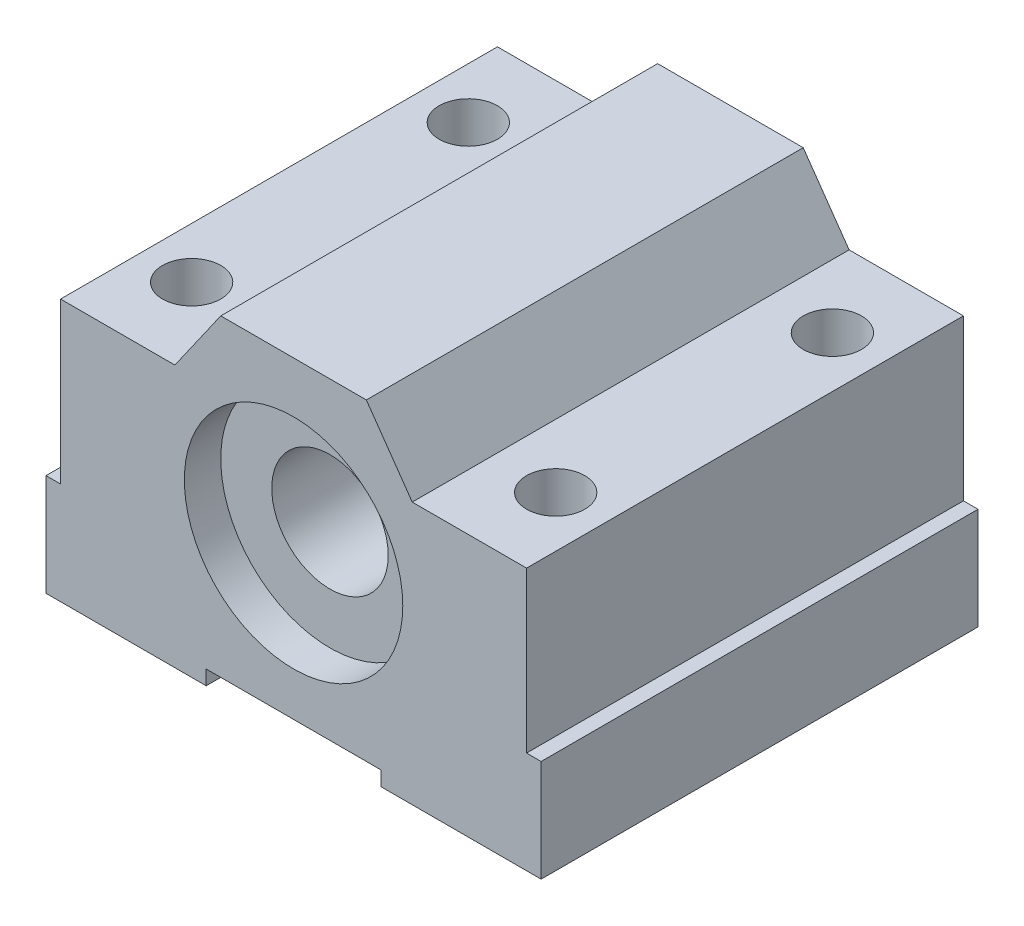
ISO-10303-21;
HEADER;
FILE_DESCRIPTION(('STEP AP214'),'2;1');
FILE_NAME('part.step','',(''),(''),'','','');
FILE_SCHEMA(('AUTOMOTIVE_DESIGN { 1 0 10303 214 1 1 1 1 }'));
ENDSEC;
DATA;
#1=APPLICATION_CONTEXT('core data for automotive mechanical design processes');
#2=APPLICATION_PROTOCOL_DEFINITION('international standard','automotive_design',2000,#1);
#3=PRODUCT_CONTEXT('',#1,'mechanical');
#4=PRODUCT('Part','Part','',(#3));
#5=PRODUCT_RELATED_PRODUCT_CATEGORY('part','',(#4));
#6=PRODUCT_DEFINITION_FORMATION('','',#4);
#7=PRODUCT_DEFINITION_CONTEXT('part definition',#1,'design');
#8=PRODUCT_DEFINITION('design','',#6,#7);
#9=PRODUCT_DEFINITION_SHAPE('','',#8);
#10=(LENGTH_UNIT() NAMED_UNIT(*) SI_UNIT(.MILLI.,.METRE.));
#11=(NAMED_UNIT(*) PLANE_ANGLE_UNIT() SI_UNIT($,.RADIAN.));
#12=(NAMED_UNIT(*) SI_UNIT($,.STERADIAN.) SOLID_ANGLE_UNIT());
#13=UNCERTAINTY_MEASURE_WITH_UNIT(LENGTH_MEASURE(1.E-05),#10,'distance_accuracy_value','');
#14=(GEOMETRIC_REPRESENTATION_CONTEXT(3) GLOBAL_UNCERTAINTY_ASSIGNED_CONTEXT((#13)) GLOBAL_UNIT_ASSIGNED_CONTEXT((#10,
#11,#12)) REPRESENTATION_CONTEXT('',''));
#15=CARTESIAN_POINT('',(0.,0.,0.));
#16=DIRECTION('',(0.,0.,1.));
#17=DIRECTION('',(1.,0.,0.));
#18=AXIS2_PLACEMENT_3D('',#15,#16,#17);
#19=CARTESIAN_POINT('',(17.,11.5,-30.));
#20=DIRECTION('',(0.,0.,1.));
#21=DIRECTION('',(1.,0.,0.));
#22=AXIS2_PLACEMENT_3D('',#19,#20,#21);
#23=CYLINDRICAL_SURFACE('',#22,4.);
#24=CARTESIAN_POINT('',(17.,11.5,-2.5));
#25=DIRECTION('',(0.,0.,1.));
#26=DIRECTION('',(1.,0.,0.));
#27=AXIS2_PLACEMENT_3D('',#24,#25,#26);
#28=CIRCLE('',#27,4.);
#29=CARTESIAN_POINT('',(21.,11.5,-2.5));
#30=VERTEX_POINT('',#29);
#31=EDGE_CURVE('E261',#30,#30,#28,.T.);
#32=ORIENTED_EDGE('',*,*,#31,.T.);
#33=EDGE_LOOP('',(#32));
#34=FACE_BOUND('',#33,.T.);
#35=CARTESIAN_POINT('',(17.,11.5,-27.5));
#36=DIRECTION('',(0.,0.,-1.));
#37=DIRECTION('',(-1.,0.,0.));
#38=AXIS2_PLACEMENT_3D('',#35,#36,#37);
#39=CIRCLE('',#38,4.);
#40=CARTESIAN_POINT('',(13.,11.5,-27.5));
#41=VERTEX_POINT('',#40);
#42=EDGE_CURVE('E38',#41,#41,#39,.F.);
#43=ORIENTED_EDGE('',*,*,#42,.F.);
#44=EDGE_LOOP('',(#43));
#45=FACE_BOUND('',#44,.T.);
#46=ADVANCED_FACE('F34',(#34,#45),#23,.F.);
#47=CARTESIAN_POINT('',(0.,18.,0.));
#48=DIRECTION('',(0.,-1.,0.));
#49=DIRECTION('',(0.,0.,-1.));
#50=AXIS2_PLACEMENT_3D('',#47,#48,#49);
#51=PLANE('',#50);
#52=CARTESIAN_POINT('',(4.5,18.,-24.5));
#53=DIRECTION('',(0.,1.,0.));
#54=DIRECTION('',(0.,0.,-1.));
#55=AXIS2_PLACEMENT_3D('',#52,#53,#54);
#56=CIRCLE('',#55,2.00000000000001);
#57=CARTESIAN_POINT('',(4.5,18.,-26.5));
#58=VERTEX_POINT('',#57);
#59=EDGE_CURVE('E447',#58,#58,#56,.T.);
#60=ORIENTED_EDGE('',*,*,#59,.F.);
#61=EDGE_LOOP('',(#60));
#62=FACE_BOUND('',#61,.T.);
#63=CARTESIAN_POINT('',(4.5,18.,-5.5));
#64=DIRECTION('',(0.,1.,0.));
#65=DIRECTION('',(0.,0.,-1.));
#66=AXIS2_PLACEMENT_3D('',#63,#64,#65);
#67=CIRCLE('',#66,2.00000000000001);
#68=CARTESIAN_POINT('',(4.5,18.,-7.50000000000001));
#69=VERTEX_POINT('',#68);
#70=EDGE_CURVE('E455',#69,#69,#67,.T.);
#71=ORIENTED_EDGE('',*,*,#70,.F.);
#72=EDGE_LOOP('',(#71));
#73=FACE_BOUND('',#72,.T.);
#74=DIRECTION('',(1.,0.,0.));
#75=VECTOR('',#74,1.);
#76=CARTESIAN_POINT('',(0.,18.,0.));
#77=LINE('',#76,#75);
#78=CARTESIAN_POINT('',(1.,18.,0.));
#79=VERTEX_POINT('',#78);
#80=CARTESIAN_POINT('',(8.85010376910488,18.,0.));
#81=VERTEX_POINT('',#80);
#82=EDGE_CURVE('E167',#79,#81,#77,.T.);
#83=ORIENTED_EDGE('',*,*,#82,.T.);
#84=DIRECTION('',(0.,0.,-1.));
#85=VECTOR('',#84,1.);
#86=CARTESIAN_POINT('',(8.85010376910488,18.,0.));
#87=LINE('',#86,#85);
#88=CARTESIAN_POINT('',(8.85010376910487,18.,-30.));
#89=VERTEX_POINT('',#88);
#90=EDGE_CURVE('E11',#81,#89,#87,.T.);
#91=ORIENTED_EDGE('',*,*,#90,.T.);
#92=DIRECTION('',(1.,0.,0.));
#93=VECTOR('',#92,1.);
#94=CARTESIAN_POINT('',(0.,18.,-30.));
#95=LINE('',#94,#93);
#96=CARTESIAN_POINT('',(1.,18.,-30.));
#97=VERTEX_POINT('',#96);
#98=EDGE_CURVE('E151',#97,#89,#95,.T.);
#99=ORIENTED_EDGE('',*,*,#98,.F.);
#100=DIRECTION('',(0.,0.,1.));
#101=VECTOR('',#100,1.);
#102=CARTESIAN_POINT('',(1.,18.,0.));
#103=LINE('',#102,#101);
#104=EDGE_CURVE('E161',#97,#79,#103,.T.);
#105=ORIENTED_EDGE('',*,*,#104,.T.);
#106=EDGE_LOOP('',(#83,#91,#99,#105));
#107=FACE_BOUND('',#106,.T.);
#108=ADVANCED_FACE('F346',(#62,#73,#107),#51,.F.);
#109=CARTESIAN_POINT('',(0.,7.,0.));
#110=DIRECTION('',(0.,-1.,0.));
#111=DIRECTION('',(0.,0.,-1.));
#112=AXIS2_PLACEMENT_3D('',#109,#110,#111);
#113=PLANE('',#112);
#114=DIRECTION('',(0.,0.,1.));
#115=VECTOR('',#114,1.);
#116=CARTESIAN_POINT('',(1.,7.,0.));
#117=LINE('',#116,#115);
#118=CARTESIAN_POINT('',(1.,7.,-30.));
#119=VERTEX_POINT('',#118);
#120=CARTESIAN_POINT('',(1.,7.,0.));
#121=VERTEX_POINT('',#120);
#122=EDGE_CURVE('E152',#119,#121,#117,.T.);
#123=ORIENTED_EDGE('',*,*,#122,.F.);
#124=DIRECTION('',(1.,0.,0.));
#125=VECTOR('',#124,1.);
#126=CARTESIAN_POINT('',(0.,7.,-30.));
#127=LINE('',#126,#125);
#128=CARTESIAN_POINT('',(0.,7.,-30.));
#129=VERTEX_POINT('',#128);
#130=EDGE_CURVE('E209',#129,#119,#127,.T.);
#131=ORIENTED_EDGE('',*,*,#130,.F.);
#132=DIRECTION('',(0.,0.,-1.));
#133=VECTOR('',#132,1.);
#134=CARTESIAN_POINT('',(0.,7.,0.));
#135=LINE('',#134,#133);
#136=CARTESIAN_POINT('',(0.,7.,0.));
#137=VERTEX_POINT('',#136);
#138=EDGE_CURVE('E204',#137,#129,#135,.T.);
#139=ORIENTED_EDGE('',*,*,#138,.F.);
#140=DIRECTION('',(1.,0.,0.));
#141=VECTOR('',#140,1.);
#142=CARTESIAN_POINT('',(0.,7.,0.));
#143=LINE('',#142,#141);
#144=EDGE_CURVE('E216',#137,#121,#143,.T.);
#145=ORIENTED_EDGE('',*,*,#144,.T.);
#146=EDGE_LOOP('',(#123,#131,#139,#145));
#147=FACE_BOUND('',#146,.T.);
#148=ADVANCED_FACE('F338',(#147),#113,.F.);
#149=CARTESIAN_POINT('',(0.,1.,-30.));
#150=DIRECTION('',(0.,0.,-1.));
#151=DIRECTION('',(-1.,0.,0.));
#152=AXIS2_PLACEMENT_3D('',#149,#150,#151);
#153=PLANE('',#152);
#154=CARTESIAN_POINT('',(17.,11.5,-30.));
#155=DIRECTION('',(0.,0.,-1.));
#156=DIRECTION('',(-1.,0.,0.));
#157=AXIS2_PLACEMENT_3D('',#154,#155,#156);
#158=CIRCLE('',#157,7.5);
#159=CARTESIAN_POINT('',(9.5,11.5,-30.));
#160=VERTEX_POINT('',#159);
#161=EDGE_CURVE('E274',#160,#160,#158,.T.);
#162=ORIENTED_EDGE('',*,*,#161,.F.);
#163=EDGE_LOOP('',(#162));
#164=FACE_BOUND('',#163,.T.);
#165=DIRECTION('',(-0.57357643635105,0.819152044288989,0.));
#166=VECTOR('',#165,1.);
#167=CARTESIAN_POINT('',(24.8632209488859,18.4094147325837,-30.));
#168=LINE('',#167,#166);
#169=CARTESIAN_POINT('',(21.9989623089514,22.5,-30.));
#170=VERTEX_POINT('',#169);
#171=CARTESIAN_POINT('',(25.1498962308951,18.,-30.));
#172=VERTEX_POINT('',#171);
#173=EDGE_CURVE('E149',#170,#172,#168,.F.);
#174=ORIENTED_EDGE('',*,*,#173,.T.);
#175=CARTESIAN_POINT('',(33.,18.,-30.));
#176=VERTEX_POINT('',#175);
#177=EDGE_CURVE('E52',#172,#176,#95,.T.);
#178=ORIENTED_EDGE('',*,*,#177,.T.);
#179=DIRECTION('',(0.,-1.,0.));
#180=VECTOR('',#179,1.);
#181=CARTESIAN_POINT('',(33.,18.,-30.));
#182=LINE('',#181,#180);
#183=CARTESIAN_POINT('',(33.,7.,-30.));
#184=VERTEX_POINT('',#183);
#185=EDGE_CURVE('E146',#176,#184,#182,.T.);
#186=ORIENTED_EDGE('',*,*,#185,.T.);
#187=CARTESIAN_POINT('',(34.,7.,-30.));
#188=VERTEX_POINT('',#187);
#189=EDGE_CURVE('E207',#184,#188,#127,.T.);
#190=ORIENTED_EDGE('',*,*,#189,.T.);
#191=DIRECTION('',(0.,-1.,0.));
#192=VECTOR('',#191,1.);
#193=CARTESIAN_POINT('',(34.,1.,-30.));
#194=LINE('',#193,#192);
#195=CARTESIAN_POINT('',(34.,0.,-30.));
#196=VERTEX_POINT('',#195);
#197=EDGE_CURVE('E228',#188,#196,#194,.T.);
#198=ORIENTED_EDGE('',*,*,#197,.T.);
#199=DIRECTION('',(1.,0.,0.));
#200=VECTOR('',#199,1.);
#201=CARTESIAN_POINT('',(0.,0.,-30.));
#202=LINE('',#201,#200);
#203=CARTESIAN_POINT('',(23.,0.,-30.));
#204=VERTEX_POINT('',#203);
#205=EDGE_CURVE('E223',#204,#196,#202,.T.);
#206=ORIENTED_EDGE('',*,*,#205,.F.);
#207=DIRECTION('',(0.,-1.,0.));
#208=VECTOR('',#207,1.);
#209=CARTESIAN_POINT('',(23.,1.,-30.));
#210=LINE('',#209,#208);
#211=CARTESIAN_POINT('',(23.,1.,-30.));
#212=VERTEX_POINT('',#211);
#213=EDGE_CURVE('E245',#212,#204,#210,.T.);
#214=ORIENTED_EDGE('',*,*,#213,.F.);
#215=DIRECTION('',(1.,0.,0.));
#216=VECTOR('',#215,1.);
#217=CARTESIAN_POINT('',(0.,1.,-30.));
#218=LINE('',#217,#216);
#219=CARTESIAN_POINT('',(11.,1.,-30.));
#220=VERTEX_POINT('',#219);
#221=EDGE_CURVE('E203',#220,#212,#218,.T.);
#222=ORIENTED_EDGE('',*,*,#221,.F.);
#223=DIRECTION('',(0.,-1.,0.));
#224=VECTOR('',#223,1.);
#225=CARTESIAN_POINT('',(11.,1.,-30.));
#226=LINE('',#225,#224);
#227=CARTESIAN_POINT('',(11.,0.,-30.));
#228=VERTEX_POINT('',#227);
#229=EDGE_CURVE('E188',#220,#228,#226,.T.);
#230=ORIENTED_EDGE('',*,*,#229,.T.);
#231=DIRECTION('',(1.,0.,0.));
#232=VECTOR('',#231,1.);
#233=CARTESIAN_POINT('',(0.,0.,-30.));
#234=LINE('',#233,#232);
#235=CARTESIAN_POINT('',(0.,0.,-30.));
#236=VERTEX_POINT('',#235);
#237=EDGE_CURVE('E180',#236,#228,#234,.T.);
#238=ORIENTED_EDGE('',*,*,#237,.F.);
#239=DIRECTION('',(0.,-1.,0.));
#240=VECTOR('',#239,1.);
#241=CARTESIAN_POINT('',(0.,7.,-30.));
#242=LINE('',#241,#240);
#243=EDGE_CURVE('E218',#129,#236,#242,.T.);
#244=ORIENTED_EDGE('',*,*,#243,.F.);
#245=ORIENTED_EDGE('',*,*,#130,.T.);
#246=DIRECTION('',(0.,-1.,0.));
#247=VECTOR('',#246,1.);
#248=CARTESIAN_POINT('',(1.,18.,-30.));
#249=LINE('',#248,#247);
#250=EDGE_CURVE('E177',#97,#119,#249,.T.);
#251=ORIENTED_EDGE('',*,*,#250,.F.);
#252=ORIENTED_EDGE('',*,*,#98,.T.);
#253=DIRECTION('',(0.573576436351051,0.819152044288989,0.));
#254=VECTOR('',#253,1.);
#255=CARTESIAN_POINT('',(-2.04887851234972,2.43464017922319,-30.));
#256=LINE('',#255,#254);
#257=CARTESIAN_POINT('',(12.0010376910486,22.5,-30.));
#258=VERTEX_POINT('',#257);
#259=EDGE_CURVE('E258',#89,#258,#256,.T.);
#260=ORIENTED_EDGE('',*,*,#259,.T.);
#261=DIRECTION('',(-1.,0.,0.));
#262=VECTOR('',#261,1.);
#263=CARTESIAN_POINT('',(0.,22.5,-30.));
#264=LINE('',#263,#262);
#265=EDGE_CURVE('E286',#170,#258,#264,.T.);
#266=ORIENTED_EDGE('',*,*,#265,.F.);
#267=EDGE_LOOP('',(#174,#178,#186,#190,#198,#206,#214,#222,#230,#238,#244,#245,#251,#252,#260,#266));
#268=FACE_BOUND('',#267,.T.);
#269=ADVANCED_FACE('F145',(#164,#268),#153,.T.);
#270=CARTESIAN_POINT('',(23.,1.,0.));
#271=DIRECTION('',(1.,0.,0.));
#272=DIRECTION('',(0.,0.,-1.));
#273=AXIS2_PLACEMENT_3D('',#270,#271,#272);
#274=PLANE('',#273);
#275=DIRECTION('',(0.,0.,1.));
#276=VECTOR('',#275,1.);
#277=CARTESIAN_POINT('',(23.,0.,0.));
#278=LINE('',#277,#276);
#279=CARTESIAN_POINT('',(23.,0.,0.));
#280=VERTEX_POINT('',#279);
#281=EDGE_CURVE('E232',#204,#280,#278,.T.);
#282=ORIENTED_EDGE('',*,*,#281,.T.);
#283=DIRECTION('',(0.,-1.,0.));
#284=VECTOR('',#283,1.);
#285=CARTESIAN_POINT('',(23.,1.,0.));
#286=LINE('',#285,#284);
#287=CARTESIAN_POINT('',(23.,1.,0.));
#288=VERTEX_POINT('',#287);
#289=EDGE_CURVE('E242',#288,#280,#286,.T.);
#290=ORIENTED_EDGE('',*,*,#289,.F.);
#291=DIRECTION('',(0.,0.,1.));
#292=VECTOR('',#291,1.);
#293=CARTESIAN_POINT('',(23.,1.,0.));
#294=LINE('',#293,#292);
#295=EDGE_CURVE('E225',#212,#288,#294,.T.);
#296=ORIENTED_EDGE('',*,*,#295,.F.);
#297=ORIENTED_EDGE('',*,*,#213,.T.);
#298=EDGE_LOOP('',(#282,#290,#296,#297));
#299=FACE_BOUND('',#298,.T.);
#300=ADVANCED_FACE('F320',(#299),#274,.F.);
#301=CARTESIAN_POINT('',(0.,1.,0.));
#302=DIRECTION('',(0.,0.,-1.));
#303=DIRECTION('',(-1.,0.,0.));
#304=AXIS2_PLACEMENT_3D('',#301,#302,#303);
#305=PLANE('',#304);
#306=CARTESIAN_POINT('',(17.,11.5,0.));
#307=DIRECTION('',(0.,0.,1.));
#308=DIRECTION('',(1.,0.,0.));
#309=AXIS2_PLACEMENT_3D('',#306,#307,#308);
#310=CIRCLE('',#309,7.5);
#311=CARTESIAN_POINT('',(24.5,11.5,0.));
#312=VERTEX_POINT('',#311);
#313=EDGE_CURVE('E263',#312,#312,#310,.T.);
#314=ORIENTED_EDGE('',*,*,#313,.F.);
#315=EDGE_LOOP('',(#314));
#316=FACE_BOUND('',#315,.T.);
#317=CARTESIAN_POINT('',(25.1498962308951,18.,0.));
#318=VERTEX_POINT('',#317);
#319=CARTESIAN_POINT('',(33.,18.,0.));
#320=VERTEX_POINT('',#319);
#321=EDGE_CURVE('E164',#318,#320,#77,.T.);
#322=ORIENTED_EDGE('',*,*,#321,.F.);
#323=DIRECTION('',(0.57357643635105,-0.819152044288989,0.));
#324=VECTOR('',#323,1.);
#325=CARTESIAN_POINT('',(25.5,17.5,0.));
#326=LINE('',#325,#324);
#327=CARTESIAN_POINT('',(21.9989623089514,22.5,0.));
#328=VERTEX_POINT('',#327);
#329=EDGE_CURVE('E250',#318,#328,#326,.F.);
#330=ORIENTED_EDGE('',*,*,#329,.T.);
#331=DIRECTION('',(1.,0.,0.));
#332=VECTOR('',#331,1.);
#333=CARTESIAN_POINT('',(0.,22.5,0.));
#334=LINE('',#333,#332);
#335=CARTESIAN_POINT('',(12.0010376910486,22.5,0.));
#336=VERTEX_POINT('',#335);
#337=EDGE_CURVE('E174',#336,#328,#334,.T.);
#338=ORIENTED_EDGE('',*,*,#337,.F.);
#339=DIRECTION('',(-0.573576436351051,-0.819152044288989,0.));
#340=VECTOR('',#339,1.);
#341=CARTESIAN_POINT('',(12.0010376910486,22.5,0.));
#342=LINE('',#341,#340);
#343=EDGE_CURVE('E247',#336,#81,#342,.T.);
#344=ORIENTED_EDGE('',*,*,#343,.T.);
#345=ORIENTED_EDGE('',*,*,#82,.F.);
#346=DIRECTION('',(0.,-1.,0.));
#347=VECTOR('',#346,1.);
#348=CARTESIAN_POINT('',(1.,18.,0.));
#349=LINE('',#348,#347);
#350=EDGE_CURVE('E181',#79,#121,#349,.T.);
#351=ORIENTED_EDGE('',*,*,#350,.T.);
#352=ORIENTED_EDGE('',*,*,#144,.F.);
#353=DIRECTION('',(0.,-1.,0.));
#354=VECTOR('',#353,1.);
#355=CARTESIAN_POINT('',(0.,7.,0.));
#356=LINE('',#355,#354);
#357=CARTESIAN_POINT('',(0.,0.,0.));
#358=VERTEX_POINT('',#357);
#359=EDGE_CURVE('E221',#137,#358,#356,.T.);
#360=ORIENTED_EDGE('',*,*,#359,.T.);
#361=DIRECTION('',(1.,0.,0.));
#362=VECTOR('',#361,1.);
#363=CARTESIAN_POINT('',(0.,0.,0.));
#364=LINE('',#363,#362);
#365=CARTESIAN_POINT('',(11.,0.,0.));
#366=VERTEX_POINT('',#365);
#367=EDGE_CURVE('E195',#358,#366,#364,.T.);
#368=ORIENTED_EDGE('',*,*,#367,.T.);
#369=DIRECTION('',(0.,-1.,0.));
#370=VECTOR('',#369,1.);
#371=CARTESIAN_POINT('',(11.,1.,0.));
#372=LINE('',#371,#370);
#373=CARTESIAN_POINT('',(11.,1.,0.));
#374=VERTEX_POINT('',#373);
#375=EDGE_CURVE('E201',#374,#366,#372,.T.);
#376=ORIENTED_EDGE('',*,*,#375,.F.);
#377=DIRECTION('',(1.,0.,0.));
#378=VECTOR('',#377,1.);
#379=CARTESIAN_POINT('',(0.,1.,0.));
#380=LINE('',#379,#378);
#381=EDGE_CURVE('E208',#374,#288,#380,.T.);
#382=ORIENTED_EDGE('',*,*,#381,.T.);
#383=ORIENTED_EDGE('',*,*,#289,.T.);
#384=DIRECTION('',(1.,0.,0.));
#385=VECTOR('',#384,1.);
#386=CARTESIAN_POINT('',(0.,0.,0.));
#387=LINE('',#386,#385);
#388=CARTESIAN_POINT('',(34.,0.,0.));
#389=VERTEX_POINT('',#388);
#390=EDGE_CURVE('E234',#280,#389,#387,.T.);
#391=ORIENTED_EDGE('',*,*,#390,.T.);
#392=DIRECTION('',(0.,-1.,0.));
#393=VECTOR('',#392,1.);
#394=CARTESIAN_POINT('',(34.,1.,0.));
#395=LINE('',#394,#393);
#396=CARTESIAN_POINT('',(34.,7.,0.));
#397=VERTEX_POINT('',#396);
#398=EDGE_CURVE('E239',#397,#389,#395,.T.);
#399=ORIENTED_EDGE('',*,*,#398,.F.);
#400=CARTESIAN_POINT('',(33.,7.,0.));
#401=VERTEX_POINT('',#400);
#402=EDGE_CURVE('E215',#401,#397,#143,.T.);
#403=ORIENTED_EDGE('',*,*,#402,.F.);
#404=DIRECTION('',(0.,-1.,0.));
#405=VECTOR('',#404,1.);
#406=CARTESIAN_POINT('',(33.,18.,0.));
#407=LINE('',#406,#405);
#408=EDGE_CURVE('E160',#320,#401,#407,.T.);
#409=ORIENTED_EDGE('',*,*,#408,.F.);
#410=EDGE_LOOP('',(#322,#330,#338,#344,#345,#351,#352,#360,#368,#376,#382,#383,#391,#399,#403,#409));
#411=FACE_BOUND('',#410,.T.);
#412=ADVANCED_FACE('F299',(#316,#411),#305,.F.);
#413=CARTESIAN_POINT('',(34.,1.,0.));
#414=DIRECTION('',(-1.,0.,0.));
#415=DIRECTION('',(0.,0.,1.));
#416=AXIS2_PLACEMENT_3D('',#413,#414,#415);
#417=PLANE('',#416);
#418=DIRECTION('',(0.,0.,-1.));
#419=VECTOR('',#418,1.);
#420=CARTESIAN_POINT('',(34.,0.,0.));
#421=LINE('',#420,#419);
#422=EDGE_CURVE('E229',#389,#196,#421,.T.);
#423=ORIENTED_EDGE('',*,*,#422,.T.);
#424=ORIENTED_EDGE('',*,*,#197,.F.);
#425=DIRECTION('',(0.,0.,-1.));
#426=VECTOR('',#425,1.);
#427=CARTESIAN_POINT('',(34.,7.,0.));
#428=LINE('',#427,#426);
#429=EDGE_CURVE('E212',#397,#188,#428,.T.);
#430=ORIENTED_EDGE('',*,*,#429,.F.);
#431=ORIENTED_EDGE('',*,*,#398,.T.);
#432=EDGE_LOOP('',(#423,#424,#430,#431));
#433=FACE_BOUND('',#432,.T.);
#434=ADVANCED_FACE('F308',(#433),#417,.F.);
#435=CARTESIAN_POINT('',(0.,0.,0.));
#436=DIRECTION('',(0.,1.,0.));
#437=DIRECTION('',(0.,0.,1.));
#438=AXIS2_PLACEMENT_3D('',#435,#436,#437);
#439=PLANE('',#438);
#440=CARTESIAN_POINT('',(29.5,0.,-5.5));
#441=DIRECTION('',(0.,1.,0.));
#442=DIRECTION('',(0.,0.,1.));
#443=AXIS2_PLACEMENT_3D('',#440,#441,#442);
#444=CIRCLE('',#443,2.00000000000001);
#445=CARTESIAN_POINT('',(29.5,0.,-3.49999999999999));
#446=VERTEX_POINT('',#445);
#447=EDGE_CURVE('E439',#446,#446,#444,.T.);
#448=ORIENTED_EDGE('',*,*,#447,.T.);
#449=EDGE_LOOP('',(#448));
#450=FACE_BOUND('',#449,.T.);
#451=CARTESIAN_POINT('',(29.5,0.,-24.5));
#452=DIRECTION('',(0.,1.,0.));
#453=DIRECTION('',(0.,0.,1.));
#454=AXIS2_PLACEMENT_3D('',#451,#452,#453);
#455=CIRCLE('',#454,2.00000000000001);
#456=CARTESIAN_POINT('',(29.5,0.,-22.5));
#457=VERTEX_POINT('',#456);
#458=EDGE_CURVE('E279',#457,#457,#455,.T.);
#459=ORIENTED_EDGE('',*,*,#458,.T.);
#460=EDGE_LOOP('',(#459));
#461=FACE_BOUND('',#460,.T.);
#462=ORIENTED_EDGE('',*,*,#205,.T.);
#463=ORIENTED_EDGE('',*,*,#422,.F.);
#464=ORIENTED_EDGE('',*,*,#390,.F.);
#465=ORIENTED_EDGE('',*,*,#281,.F.);
#466=EDGE_LOOP('',(#462,#463,#464,#465));
#467=FACE_BOUND('',#466,.T.);
#468=ADVANCED_FACE('F313',(#450,#461,#467),#439,.F.);
#469=CARTESIAN_POINT('',(0.,7.,0.));
#470=DIRECTION('',(-1.,0.,0.));
#471=DIRECTION('',(0.,0.,1.));
#472=AXIS2_PLACEMENT_3D('',#469,#470,#471);
#473=PLANE('',#472);
#474=ORIENTED_EDGE('',*,*,#243,.T.);
#475=DIRECTION('',(0.,0.,-1.));
#476=VECTOR('',#475,1.);
#477=CARTESIAN_POINT('',(0.,0.,0.));
#478=LINE('',#477,#476);
#479=EDGE_CURVE('E192',#358,#236,#478,.T.);
#480=ORIENTED_EDGE('',*,*,#479,.F.);
#481=ORIENTED_EDGE('',*,*,#359,.F.);
#482=ORIENTED_EDGE('',*,*,#138,.T.);
#483=EDGE_LOOP('',(#474,#480,#481,#482));
#484=FACE_BOUND('',#483,.T.);
#485=ADVANCED_FACE('F333',(#484),#473,.T.);
#486=ORIENTED_EDGE('',*,*,#189,.F.);
#487=DIRECTION('',(0.,0.,1.));
#488=VECTOR('',#487,1.);
#489=CARTESIAN_POINT('',(33.,7.,0.));
#490=LINE('',#489,#488);
#491=EDGE_CURVE('E159',#184,#401,#490,.T.);
#492=ORIENTED_EDGE('',*,*,#491,.T.);
#493=ORIENTED_EDGE('',*,*,#402,.T.);
#494=ORIENTED_EDGE('',*,*,#429,.T.);
#495=EDGE_LOOP('',(#486,#492,#493,#494));
#496=FACE_BOUND('',#495,.T.);
#497=ADVANCED_FACE('F304',(#496),#113,.F.);
#498=CARTESIAN_POINT('',(0.,1.,0.));
#499=DIRECTION('',(0.,-1.,0.));
#500=DIRECTION('',(0.,0.,-1.));
#501=AXIS2_PLACEMENT_3D('',#498,#499,#500);
#502=PLANE('',#501);
#503=DIRECTION('',(0.,0.,1.));
#504=VECTOR('',#503,1.);
#505=CARTESIAN_POINT('',(11.,1.,0.));
#506=LINE('',#505,#504);
#507=EDGE_CURVE('E185',#220,#374,#506,.T.);
#508=ORIENTED_EDGE('',*,*,#507,.F.);
#509=ORIENTED_EDGE('',*,*,#221,.T.);
#510=ORIENTED_EDGE('',*,*,#295,.T.);
#511=ORIENTED_EDGE('',*,*,#381,.F.);
#512=EDGE_LOOP('',(#508,#509,#510,#511));
#513=FACE_BOUND('',#512,.T.);
#514=ADVANCED_FACE('F322',(#513),#502,.T.);
#515=CARTESIAN_POINT('',(11.,1.,0.));
#516=DIRECTION('',(1.,0.,0.));
#517=DIRECTION('',(0.,0.,-1.));
#518=AXIS2_PLACEMENT_3D('',#515,#516,#517);
#519=PLANE('',#518);
#520=DIRECTION('',(0.,0.,1.));
#521=VECTOR('',#520,1.);
#522=CARTESIAN_POINT('',(11.,0.,0.));
#523=LINE('',#522,#521);
#524=EDGE_CURVE('E189',#228,#366,#523,.T.);
#525=ORIENTED_EDGE('',*,*,#524,.F.);
#526=ORIENTED_EDGE('',*,*,#229,.F.);
#527=ORIENTED_EDGE('',*,*,#507,.T.);
#528=ORIENTED_EDGE('',*,*,#375,.T.);
#529=EDGE_LOOP('',(#525,#526,#527,#528));
#530=FACE_BOUND('',#529,.T.);
#531=ADVANCED_FACE('F326',(#530),#519,.T.);
#532=CARTESIAN_POINT('',(0.,0.,0.));
#533=DIRECTION('',(0.,1.,0.));
#534=DIRECTION('',(0.,0.,1.));
#535=AXIS2_PLACEMENT_3D('',#532,#533,#534);
#536=PLANE('',#535);
#537=CARTESIAN_POINT('',(4.5,0.,-24.5));
#538=DIRECTION('',(0.,1.,0.));
#539=DIRECTION('',(0.,0.,-1.));
#540=AXIS2_PLACEMENT_3D('',#537,#538,#539);
#541=CIRCLE('',#540,2.00000000000001);
#542=CARTESIAN_POINT('',(4.5,0.,-26.5));
#543=VERTEX_POINT('',#542);
#544=EDGE_CURVE('E443',#543,#543,#541,.T.);
#545=ORIENTED_EDGE('',*,*,#544,.T.);
#546=EDGE_LOOP('',(#545));
#547=FACE_BOUND('',#546,.T.);
#548=CARTESIAN_POINT('',(4.5,0.,-5.5));
#549=DIRECTION('',(0.,1.,0.));
#550=DIRECTION('',(0.,0.,-1.));
#551=AXIS2_PLACEMENT_3D('',#548,#549,#550);
#552=CIRCLE('',#551,2.00000000000001);
#553=CARTESIAN_POINT('',(4.5,0.,-7.50000000000001));
#554=VERTEX_POINT('',#553);
#555=EDGE_CURVE('E452',#554,#554,#552,.T.);
#556=ORIENTED_EDGE('',*,*,#555,.T.);
#557=EDGE_LOOP('',(#556));
#558=FACE_BOUND('',#557,.T.);
#559=ORIENTED_EDGE('',*,*,#237,.T.);
#560=ORIENTED_EDGE('',*,*,#524,.T.);
#561=ORIENTED_EDGE('',*,*,#367,.F.);
#562=ORIENTED_EDGE('',*,*,#479,.T.);
#563=EDGE_LOOP('',(#559,#560,#561,#562));
#564=FACE_BOUND('',#563,.T.);
#565=ADVANCED_FACE('F329',(#547,#558,#564),#536,.F.);
#566=CARTESIAN_POINT('',(1.,18.,0.));
#567=DIRECTION('',(1.,0.,0.));
#568=DIRECTION('',(0.,0.,-1.));
#569=AXIS2_PLACEMENT_3D('',#566,#567,#568);
#570=PLANE('',#569);
#571=ORIENTED_EDGE('',*,*,#122,.T.);
#572=ORIENTED_EDGE('',*,*,#350,.F.);
#573=ORIENTED_EDGE('',*,*,#104,.F.);
#574=ORIENTED_EDGE('',*,*,#250,.T.);
#575=EDGE_LOOP('',(#571,#572,#573,#574));
#576=FACE_BOUND('',#575,.T.);
#577=ADVANCED_FACE('F341',(#576),#570,.F.);
#578=CARTESIAN_POINT('',(33.,18.,0.));
#579=DIRECTION('',(1.,0.,0.));
#580=DIRECTION('',(0.,0.,-1.));
#581=AXIS2_PLACEMENT_3D('',#578,#579,#580);
#582=PLANE('',#581);
#583=ORIENTED_EDGE('',*,*,#491,.F.);
#584=ORIENTED_EDGE('',*,*,#185,.F.);
#585=DIRECTION('',(0.,0.,1.));
#586=VECTOR('',#585,1.);
#587=CARTESIAN_POINT('',(33.,18.,0.));
#588=LINE('',#587,#586);
#589=EDGE_CURVE('E158',#176,#320,#588,.T.);
#590=ORIENTED_EDGE('',*,*,#589,.T.);
#591=ORIENTED_EDGE('',*,*,#408,.T.);
#592=EDGE_LOOP('',(#583,#584,#590,#591));
#593=FACE_BOUND('',#592,.T.);
#594=ADVANCED_FACE('F156',(#593),#582,.T.);
#595=CARTESIAN_POINT('',(29.5,18.,-5.5));
#596=DIRECTION('',(0.,1.,0.));
#597=DIRECTION('',(0.,0.,1.));
#598=AXIS2_PLACEMENT_3D('',#595,#596,#597);
#599=CIRCLE('',#598,2.00000000000001);
#600=CARTESIAN_POINT('',(29.5,18.,-3.49999999999999));
#601=VERTEX_POINT('',#600);
#602=EDGE_CURVE('E442',#601,#601,#599,.T.);
#603=ORIENTED_EDGE('',*,*,#602,.F.);
#604=EDGE_LOOP('',(#603));
#605=FACE_BOUND('',#604,.T.);
#606=CARTESIAN_POINT('',(29.5,18.,-24.5));
#607=DIRECTION('',(0.,1.,0.));
#608=DIRECTION('',(0.,0.,1.));
#609=AXIS2_PLACEMENT_3D('',#606,#607,#608);
#610=CIRCLE('',#609,2.00000000000001);
#611=CARTESIAN_POINT('',(29.5,18.,-22.5));
#612=VERTEX_POINT('',#611);
#613=EDGE_CURVE('E282',#612,#612,#610,.T.);
#614=ORIENTED_EDGE('',*,*,#613,.F.);
#615=EDGE_LOOP('',(#614));
#616=FACE_BOUND('',#615,.T.);
#617=ORIENTED_EDGE('',*,*,#177,.F.);
#618=DIRECTION('',(0.,0.,-1.));
#619=VECTOR('',#618,1.);
#620=CARTESIAN_POINT('',(25.1498962308951,18.,0.));
#621=LINE('',#620,#619);
#622=EDGE_CURVE('E44',#172,#318,#621,.F.);
#623=ORIENTED_EDGE('',*,*,#622,.T.);
#624=ORIENTED_EDGE('',*,*,#321,.T.);
#625=ORIENTED_EDGE('',*,*,#589,.F.);
#626=EDGE_LOOP('',(#617,#623,#624,#625));
#627=FACE_BOUND('',#626,.T.);
#628=ADVANCED_FACE('F163',(#605,#616,#627),#51,.F.);
#629=CARTESIAN_POINT('',(0.,22.5,0.));
#630=DIRECTION('',(0.,1.,0.));
#631=DIRECTION('',(0.,0.,1.));
#632=AXIS2_PLACEMENT_3D('',#629,#630,#631);
#633=PLANE('',#632);
#634=ORIENTED_EDGE('',*,*,#337,.T.);
#635=DIRECTION('',(0.,0.,-1.));
#636=VECTOR('',#635,1.);
#637=CARTESIAN_POINT('',(21.9989623089514,22.5,0.));
#638=LINE('',#637,#636);
#639=EDGE_CURVE('E255',#328,#170,#638,.T.);
#640=ORIENTED_EDGE('',*,*,#639,.T.);
#641=ORIENTED_EDGE('',*,*,#265,.T.);
#642=DIRECTION('',(0.,0.,1.));
#643=VECTOR('',#642,1.);
#644=CARTESIAN_POINT('',(12.0010376910486,22.5,0.));
#645=LINE('',#644,#643);
#646=EDGE_CURVE('E252',#258,#336,#645,.T.);
#647=ORIENTED_EDGE('',*,*,#646,.T.);
#648=EDGE_LOOP('',(#634,#640,#641,#647));
#649=FACE_BOUND('',#648,.T.);
#650=ADVANCED_FACE('F293',(#649),#633,.T.);
#651=CARTESIAN_POINT('',(25.5,17.5,0.));
#652=DIRECTION('',(-0.819152044288989,-0.57357643635105,0.));
#653=DIRECTION('',(0.,0.,1.));
#654=AXIS2_PLACEMENT_3D('',#651,#652,#653);
#655=PLANE('',#654);
#656=ORIENTED_EDGE('',*,*,#173,.F.);
#657=ORIENTED_EDGE('',*,*,#639,.F.);
#658=ORIENTED_EDGE('',*,*,#329,.F.);
#659=ORIENTED_EDGE('',*,*,#622,.F.);
#660=EDGE_LOOP('',(#656,#657,#658,#659));
#661=FACE_BOUND('',#660,.T.);
#662=ADVANCED_FACE('F298',(#661),#655,.F.);
#663=CARTESIAN_POINT('',(12.0010376910486,22.5,0.));
#664=DIRECTION('',(-0.819152044288989,0.573576436351051,0.));
#665=DIRECTION('',(0.,0.,-1.));
#666=AXIS2_PLACEMENT_3D('',#663,#664,#665);
#667=PLANE('',#666);
#668=ORIENTED_EDGE('',*,*,#259,.F.);
#669=ORIENTED_EDGE('',*,*,#90,.F.);
#670=ORIENTED_EDGE('',*,*,#343,.F.);
#671=ORIENTED_EDGE('',*,*,#646,.F.);
#672=EDGE_LOOP('',(#668,#669,#670,#671));
#673=FACE_BOUND('',#672,.T.);
#674=ADVANCED_FACE('F36',(#673),#667,.T.);
#675=CARTESIAN_POINT('',(17.,11.5,-2.5));
#676=DIRECTION('',(0.,0.,1.));
#677=DIRECTION('',(1.,0.,0.));
#678=AXIS2_PLACEMENT_3D('',#675,#676,#677);
#679=CYLINDRICAL_SURFACE('',#678,7.5);
#680=CARTESIAN_POINT('',(17.,11.5,-2.5));
#681=DIRECTION('',(0.,0.,1.));
#682=DIRECTION('',(1.,0.,0.));
#683=AXIS2_PLACEMENT_3D('',#680,#681,#682);
#684=CIRCLE('',#683,7.5);
#685=CARTESIAN_POINT('',(24.5,11.5,-2.5));
#686=VERTEX_POINT('',#685);
#687=EDGE_CURVE('E267',#686,#686,#684,.T.);
#688=ORIENTED_EDGE('',*,*,#687,.F.);
#689=EDGE_LOOP('',(#688));
#690=FACE_BOUND('',#689,.T.);
#691=ORIENTED_EDGE('',*,*,#313,.T.);
#692=EDGE_LOOP('',(#691));
#693=FACE_BOUND('',#692,.T.);
#694=ADVANCED_FACE('F351',(#690,#693),#679,.F.);
#695=CARTESIAN_POINT('',(0.,0.,-2.5));
#696=DIRECTION('',(0.,0.,1.));
#697=DIRECTION('',(1.,0.,0.));
#698=AXIS2_PLACEMENT_3D('',#695,#696,#697);
#699=PLANE('',#698);
#700=ORIENTED_EDGE('',*,*,#31,.F.);
#701=EDGE_LOOP('',(#700));
#702=FACE_BOUND('',#701,.T.);
#703=ORIENTED_EDGE('',*,*,#687,.T.);
#704=EDGE_LOOP('',(#703));
#705=FACE_BOUND('',#704,.T.);
#706=ADVANCED_FACE('F356',(#702,#705),#699,.T.);
#707=CARTESIAN_POINT('',(17.,11.5,-27.5));
#708=DIRECTION('',(0.,0.,-1.));
#709=DIRECTION('',(-1.,0.,0.));
#710=AXIS2_PLACEMENT_3D('',#707,#708,#709);
#711=PLANE('',#710);
#712=CARTESIAN_POINT('',(17.,11.5,-27.5));
#713=DIRECTION('',(0.,0.,-1.));
#714=DIRECTION('',(-1.,0.,0.));
#715=AXIS2_PLACEMENT_3D('',#712,#713,#714);
#716=CIRCLE('',#715,7.5);
#717=CARTESIAN_POINT('',(9.5,11.5,-27.5));
#718=VERTEX_POINT('',#717);
#719=EDGE_CURVE('E270',#718,#718,#716,.T.);
#720=ORIENTED_EDGE('',*,*,#719,.T.);
#721=EDGE_LOOP('',(#720));
#722=FACE_BOUND('',#721,.T.);
#723=ORIENTED_EDGE('',*,*,#42,.T.);
#724=EDGE_LOOP('',(#723));
#725=FACE_BOUND('',#724,.T.);
#726=ADVANCED_FACE('F372',(#722,#725),#711,.T.);
#727=CARTESIAN_POINT('',(17.,11.5,-27.5));
#728=DIRECTION('',(0.,0.,-1.));
#729=DIRECTION('',(-1.,0.,0.));
#730=AXIS2_PLACEMENT_3D('',#727,#728,#729);
#731=CYLINDRICAL_SURFACE('',#730,7.5);
#732=ORIENTED_EDGE('',*,*,#719,.F.);
#733=EDGE_LOOP('',(#732));
#734=FACE_BOUND('',#733,.T.);
#735=ORIENTED_EDGE('',*,*,#161,.T.);
#736=EDGE_LOOP('',(#735));
#737=FACE_BOUND('',#736,.T.);
#738=ADVANCED_FACE('F369',(#734,#737),#731,.F.);
#739=CARTESIAN_POINT('',(29.5,0.,-24.5));
#740=DIRECTION('',(0.,1.,0.));
#741=DIRECTION('',(0.,0.,1.));
#742=AXIS2_PLACEMENT_3D('',#739,#740,#741);
#743=CYLINDRICAL_SURFACE('',#742,2.00000000000001);
#744=ORIENTED_EDGE('',*,*,#458,.F.);
#745=EDGE_LOOP('',(#744));
#746=FACE_BOUND('',#745,.T.);
#747=ORIENTED_EDGE('',*,*,#613,.T.);
#748=EDGE_LOOP('',(#747));
#749=FACE_BOUND('',#748,.T.);
#750=ADVANCED_FACE('F412',(#746,#749),#743,.F.);
#751=CARTESIAN_POINT('',(29.5,0.,-5.5));
#752=DIRECTION('',(0.,1.,0.));
#753=DIRECTION('',(0.,0.,1.));
#754=AXIS2_PLACEMENT_3D('',#751,#752,#753);
#755=CYLINDRICAL_SURFACE('',#754,2.00000000000001);
#756=ORIENTED_EDGE('',*,*,#447,.F.);
#757=EDGE_LOOP('',(#756));
#758=FACE_BOUND('',#757,.T.);
#759=ORIENTED_EDGE('',*,*,#602,.T.);
#760=EDGE_LOOP('',(#759));
#761=FACE_BOUND('',#760,.T.);
#762=ADVANCED_FACE('F418',(#758,#761),#755,.F.);
#763=CARTESIAN_POINT('',(4.5,0.,-5.5));
#764=DIRECTION('',(0.,1.,0.));
#765=DIRECTION('',(0.,0.,1.));
#766=AXIS2_PLACEMENT_3D('',#763,#764,#765);
#767=CYLINDRICAL_SURFACE('',#766,2.00000000000001);
#768=ORIENTED_EDGE('',*,*,#555,.F.);
#769=EDGE_LOOP('',(#768));
#770=FACE_BOUND('',#769,.T.);
#771=ORIENTED_EDGE('',*,*,#70,.T.);
#772=EDGE_LOOP('',(#771));
#773=FACE_BOUND('',#772,.T.);
#774=ADVANCED_FACE('F424',(#770,#773),#767,.F.);
#775=CARTESIAN_POINT('',(4.5,0.,-24.5));
#776=DIRECTION('',(0.,1.,0.));
#777=DIRECTION('',(0.,0.,1.));
#778=AXIS2_PLACEMENT_3D('',#775,#776,#777);
#779=CYLINDRICAL_SURFACE('',#778,2.00000000000001);
#780=ORIENTED_EDGE('',*,*,#544,.F.);
#781=EDGE_LOOP('',(#780));
#782=FACE_BOUND('',#781,.T.);
#783=ORIENTED_EDGE('',*,*,#59,.T.);
#784=EDGE_LOOP('',(#783));
#785=FACE_BOUND('',#784,.T.);
#786=ADVANCED_FACE('F427',(#782,#785),#779,.F.);
#787=CLOSED_SHELL('',(#46,#108,#148,#269,#300,#412,#434,#468,#485,#497,#514,#531,#565,#577,#594,
#628,#650,#662,#674,#694,#706,#726,#738,#750,#762,#774,#786));
#788=MANIFOLD_SOLID_BREP('B2',#787);
#789=ADVANCED_BREP_SHAPE_REPRESENTATION('',(#18,#788),#14);
#790=SHAPE_DEFINITION_REPRESENTATION(#9,#789);
ENDSEC;
END-ISO-10303-21;
